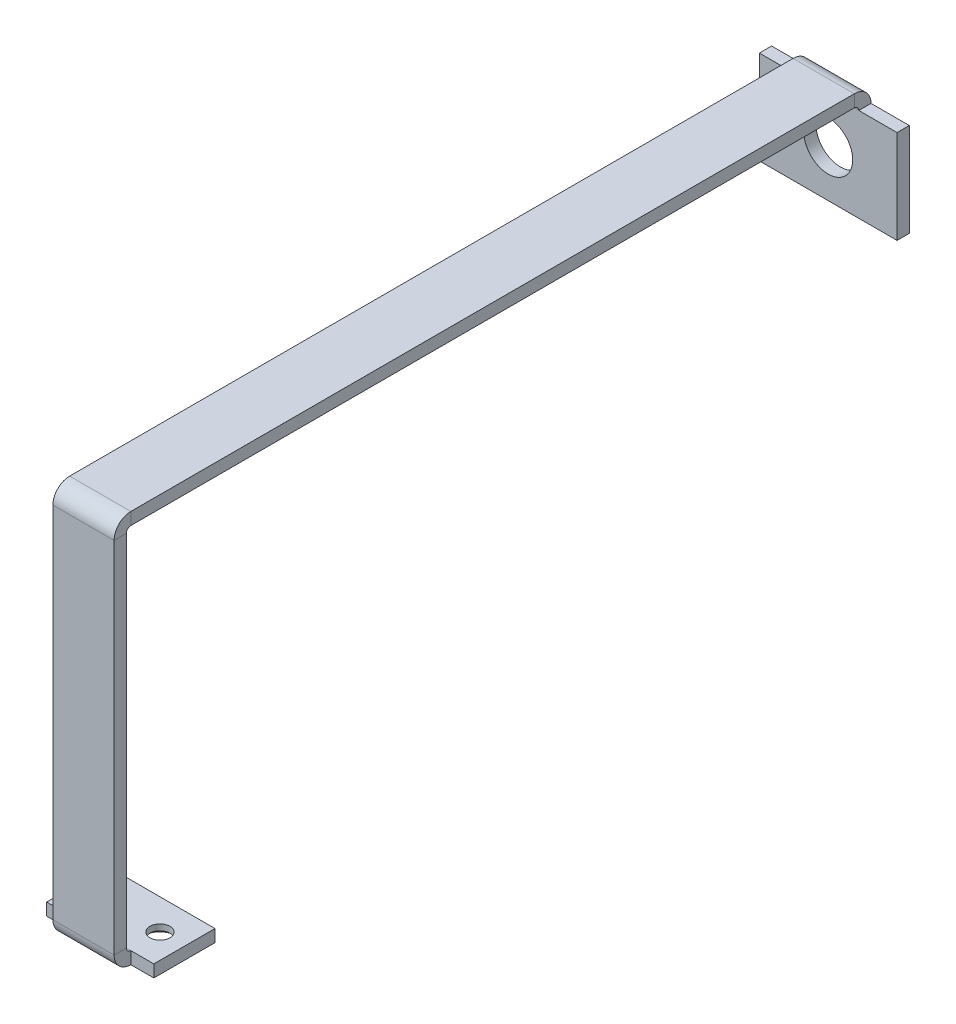
ISO-10303-21;
HEADER;
FILE_DESCRIPTION(('STEP AP214'),'2;1');
FILE_NAME('part.step','',(''),(''),'','','');
FILE_SCHEMA(('AUTOMOTIVE_DESIGN { 1 0 10303 214 1 1 1 1 }'));
ENDSEC;
DATA;
#1=APPLICATION_CONTEXT('core data for automotive mechanical design processes');
#2=APPLICATION_PROTOCOL_DEFINITION('international standard','automotive_design',2000,#1);
#3=PRODUCT_CONTEXT('',#1,'mechanical');
#4=PRODUCT('Part','Part','',(#3));
#5=PRODUCT_RELATED_PRODUCT_CATEGORY('part','',(#4));
#6=PRODUCT_DEFINITION_FORMATION('','',#4);
#7=PRODUCT_DEFINITION_CONTEXT('part definition',#1,'design');
#8=PRODUCT_DEFINITION('design','',#6,#7);
#9=PRODUCT_DEFINITION_SHAPE('','',#8);
#10=(LENGTH_UNIT() NAMED_UNIT(*) SI_UNIT(.MILLI.,.METRE.));
#11=(NAMED_UNIT(*) PLANE_ANGLE_UNIT() SI_UNIT($,.RADIAN.));
#12=(NAMED_UNIT(*) SI_UNIT($,.STERADIAN.) SOLID_ANGLE_UNIT());
#13=UNCERTAINTY_MEASURE_WITH_UNIT(LENGTH_MEASURE(1.E-05),#10,'distance_accuracy_value','');
#14=(GEOMETRIC_REPRESENTATION_CONTEXT(3) GLOBAL_UNCERTAINTY_ASSIGNED_CONTEXT((#13)) GLOBAL_UNIT_ASSIGNED_CONTEXT((#10,
#11,#12)) REPRESENTATION_CONTEXT('',''));
#15=CARTESIAN_POINT('',(0.,0.,0.));
#16=DIRECTION('',(0.,0.,1.));
#17=DIRECTION('',(1.,0.,0.));
#18=AXIS2_PLACEMENT_3D('',#15,#16,#17);
#19=CARTESIAN_POINT('',(0.,2.,0.));
#20=DIRECTION('',(0.,1.,0.));
#21=DIRECTION('',(0.,0.,1.));
#22=AXIS2_PLACEMENT_3D('',#19,#20,#21);
#23=PLANE('',#22);
#24=CARTESIAN_POINT('',(-4.75,2.,0.));
#25=DIRECTION('',(0.,1.,0.));
#26=DIRECTION('',(0.,0.,1.));
#27=AXIS2_PLACEMENT_3D('',#24,#25,#26);
#28=CIRCLE('',#27,1.63194999999999);
#29=CARTESIAN_POINT('',(-4.75,2.,1.63194999999999));
#30=VERTEX_POINT('',#29);
#31=EDGE_CURVE('E551',#30,#30,#28,.F.);
#32=ORIENTED_EDGE('',*,*,#31,.T.);
#33=EDGE_LOOP('',(#32));
#34=FACE_BOUND('',#33,.T.);
#35=DIRECTION('',(0.,0.,-1.));
#36=VECTOR('',#35,1.);
#37=CARTESIAN_POINT('',(8.75,2.,-5.));
#38=LINE('',#37,#36);
#39=CARTESIAN_POINT('',(8.75,2.,5.));
#40=VERTEX_POINT('',#39);
#41=CARTESIAN_POINT('',(8.75,2.,-5.));
#42=VERTEX_POINT('',#41);
#43=EDGE_CURVE('E454',#40,#42,#38,.T.);
#44=ORIENTED_EDGE('',*,*,#43,.T.);
#45=DIRECTION('',(-1.,0.,0.));
#46=VECTOR('',#45,1.);
#47=CARTESIAN_POINT('',(-8.75,2.,-5.));
#48=LINE('',#47,#46);
#49=CARTESIAN_POINT('',(-8.75,2.,-5.));
#50=VERTEX_POINT('',#49);
#51=EDGE_CURVE('E458',#42,#50,#48,.T.);
#52=ORIENTED_EDGE('',*,*,#51,.T.);
#53=DIRECTION('',(0.,0.,1.));
#54=VECTOR('',#53,1.);
#55=CARTESIAN_POINT('',(-8.75,2.,-5.));
#56=LINE('',#55,#54);
#57=CARTESIAN_POINT('',(-8.75,2.,5.));
#58=VERTEX_POINT('',#57);
#59=EDGE_CURVE('E462',#50,#58,#56,.T.);
#60=ORIENTED_EDGE('',*,*,#59,.T.);
#61=DIRECTION('',(1.,0.,0.));
#62=VECTOR('',#61,1.);
#63=CARTESIAN_POINT('',(-8.75,2.,5.));
#64=LINE('',#63,#62);
#65=CARTESIAN_POINT('',(-4.99999999999999,2.,5.));
#66=VERTEX_POINT('',#65);
#67=EDGE_CURVE('E466',#58,#66,#64,.T.);
#68=ORIENTED_EDGE('',*,*,#67,.T.);
#69=DIRECTION('',(1.,0.,0.));
#70=VECTOR('',#69,1.);
#71=CARTESIAN_POINT('',(4.99999999999999,2.,5.));
#72=LINE('',#71,#70);
#73=CARTESIAN_POINT('',(4.99999999999999,2.,5.));
#74=VERTEX_POINT('',#73);
#75=EDGE_CURVE('E441',#74,#66,#72,.F.);
#76=ORIENTED_EDGE('',*,*,#75,.F.);
#77=EDGE_CURVE('E465',#74,#40,#64,.T.);
#78=ORIENTED_EDGE('',*,*,#77,.T.);
#79=EDGE_LOOP('',(#44,#52,#60,#68,#76,#78));
#80=FACE_BOUND('',#79,.T.);
#81=CARTESIAN_POINT('',(4.75,2.,0.));
#82=DIRECTION('',(0.,1.,0.));
#83=DIRECTION('',(0.,0.,1.));
#84=AXIS2_PLACEMENT_3D('',#81,#82,#83);
#85=CIRCLE('',#84,1.63194999999999);
#86=CARTESIAN_POINT('',(4.75,2.,1.63194999999999));
#87=VERTEX_POINT('',#86);
#88=EDGE_CURVE('E539',#87,#87,#85,.F.);
#89=ORIENTED_EDGE('',*,*,#88,.T.);
#90=EDGE_LOOP('',(#89));
#91=FACE_BOUND('',#90,.T.);
#92=ADVANCED_FACE('F107',(#34,#80,#91),#23,.T.);
#93=CARTESIAN_POINT('',(4.99999999999998,64.1500000000004,-115.9484));
#94=DIRECTION('',(-1.,0.,0.));
#95=DIRECTION('',(0.,0.,1.));
#96=AXIS2_PLACEMENT_3D('',#93,#94,#95);
#97=PLANE('',#96);
#98=DIRECTION('',(0.,1.,0.));
#99=VECTOR('',#98,1.);
#100=CARTESIAN_POINT('',(4.99999999999998,62.1500000000004,-113.2118));
#101=LINE('',#100,#99);
#102=CARTESIAN_POINT('',(4.99999999999998,62.1500000000004,-113.2118));
#103=VERTEX_POINT('',#102);
#104=CARTESIAN_POINT('',(4.99999999999998,64.1500000000004,-113.2118));
#105=VERTEX_POINT('',#104);
#106=EDGE_CURVE('E307',#103,#105,#101,.T.);
#107=ORIENTED_EDGE('',*,*,#106,.T.);
#108=DIRECTION('',(0.,0.,-1.));
#109=VECTOR('',#108,1.);
#110=CARTESIAN_POINT('',(4.99999999999998,64.15,2.3363962117504E-13));
#111=LINE('',#110,#109);
#112=CARTESIAN_POINT('',(4.99999999999998,64.15,5.));
#113=VERTEX_POINT('',#112);
#114=EDGE_CURVE('E346',#113,#105,#111,.T.);
#115=ORIENTED_EDGE('',*,*,#114,.F.);
#116=DIRECTION('',(0.,-1.,0.));
#117=VECTOR('',#116,1.);
#118=CARTESIAN_POINT('',(4.99999999999998,62.15,4.99999999999999));
#119=LINE('',#118,#117);
#120=CARTESIAN_POINT('',(4.99999999999998,62.15,4.99999999999999));
#121=VERTEX_POINT('',#120);
#122=EDGE_CURVE('E359',#121,#113,#119,.F.);
#123=ORIENTED_EDGE('',*,*,#122,.F.);
#124=DIRECTION('',(0.,0.,1.));
#125=VECTOR('',#124,1.);
#126=CARTESIAN_POINT('',(4.99999999999998,62.1500000000004,-115.9484));
#127=LINE('',#126,#125);
#128=EDGE_CURVE('E352',#121,#103,#127,.F.);
#129=ORIENTED_EDGE('',*,*,#128,.T.);
#130=EDGE_LOOP('',(#107,#115,#123,#129));
#131=FACE_BOUND('',#130,.T.);
#132=ADVANCED_FACE('F595',(#131),#97,.F.);
#133=CARTESIAN_POINT('',(-5.00000000000002,64.15,5.7366));
#134=DIRECTION('',(1.,0.,0.));
#135=DIRECTION('',(0.,0.,-1.));
#136=AXIS2_PLACEMENT_3D('',#133,#134,#135);
#137=PLANE('',#136);
#138=DIRECTION('',(0.,1.,0.));
#139=VECTOR('',#138,1.);
#140=CARTESIAN_POINT('',(-5.00000000000002,62.1500000000004,-113.2118));
#141=LINE('',#140,#139);
#142=CARTESIAN_POINT('',(-5.00000000000002,62.1500000000004,-113.2118));
#143=VERTEX_POINT('',#142);
#144=CARTESIAN_POINT('',(-5.00000000000002,64.1500000000004,-113.2118));
#145=VERTEX_POINT('',#144);
#146=EDGE_CURVE('E328',#143,#145,#141,.T.);
#147=ORIENTED_EDGE('',*,*,#146,.F.);
#148=DIRECTION('',(0.,0.,-1.));
#149=VECTOR('',#148,1.);
#150=CARTESIAN_POINT('',(-5.00000000000002,62.15,5.7366));
#151=LINE('',#150,#149);
#152=CARTESIAN_POINT('',(-5.00000000000001,62.15,4.99999999999999));
#153=VERTEX_POINT('',#152);
#154=EDGE_CURVE('E349',#143,#153,#151,.F.);
#155=ORIENTED_EDGE('',*,*,#154,.T.);
#156=DIRECTION('',(0.,-1.,0.));
#157=VECTOR('',#156,1.);
#158=CARTESIAN_POINT('',(-5.00000000000002,64.15,5.));
#159=LINE('',#158,#157);
#160=CARTESIAN_POINT('',(-5.00000000000001,64.15,5.));
#161=VERTEX_POINT('',#160);
#162=EDGE_CURVE('E338',#153,#161,#159,.F.);
#163=ORIENTED_EDGE('',*,*,#162,.T.);
#164=DIRECTION('',(0.,0.,1.));
#165=VECTOR('',#164,1.);
#166=CARTESIAN_POINT('',(-5.00000000000002,64.15,2.33924738235643E-13));
#167=LINE('',#166,#165);
#168=EDGE_CURVE('E342',#145,#161,#167,.T.);
#169=ORIENTED_EDGE('',*,*,#168,.F.);
#170=EDGE_LOOP('',(#147,#155,#163,#169));
#171=FACE_BOUND('',#170,.T.);
#172=ADVANCED_FACE('F602',(#171),#137,.F.);
#173=CARTESIAN_POINT('',(0.,64.15,2.33782179705342E-13));
#174=DIRECTION('',(0.,-1.,0.));
#175=DIRECTION('',(0.,0.,-1.));
#176=AXIS2_PLACEMENT_3D('',#173,#174,#175);
#177=PLANE('',#176);
#178=DIRECTION('',(1.,0.,0.));
#179=VECTOR('',#178,1.);
#180=CARTESIAN_POINT('',(4.99999999999998,64.1500000000004,-113.2118));
#181=LINE('',#180,#179);
#182=EDGE_CURVE('E300',#105,#145,#181,.F.);
#183=ORIENTED_EDGE('',*,*,#182,.T.);
#184=ORIENTED_EDGE('',*,*,#168,.T.);
#185=DIRECTION('',(1.,0.,0.));
#186=VECTOR('',#185,1.);
#187=CARTESIAN_POINT('',(-5.00000000000002,64.15,5.));
#188=LINE('',#187,#186);
#189=EDGE_CURVE('E355',#113,#161,#188,.F.);
#190=ORIENTED_EDGE('',*,*,#189,.F.);
#191=ORIENTED_EDGE('',*,*,#114,.T.);
#192=EDGE_LOOP('',(#183,#184,#190,#191));
#193=FACE_BOUND('',#192,.T.);
#194=ADVANCED_FACE('F726',(#193),#177,.F.);
#195=CARTESIAN_POINT('',(0.,62.15,2.26799217027655E-13));
#196=DIRECTION('',(0.,-1.,0.));
#197=DIRECTION('',(0.,0.,-1.));
#198=AXIS2_PLACEMENT_3D('',#195,#196,#197);
#199=PLANE('',#198);
#200=ORIENTED_EDGE('',*,*,#154,.F.);
#201=DIRECTION('',(1.,0.,0.));
#202=VECTOR('',#201,1.);
#203=CARTESIAN_POINT('',(4.99999999999998,62.1500000000004,-113.2118));
#204=LINE('',#203,#202);
#205=EDGE_CURVE('E123',#103,#143,#204,.F.);
#206=ORIENTED_EDGE('',*,*,#205,.F.);
#207=ORIENTED_EDGE('',*,*,#128,.F.);
#208=DIRECTION('',(1.,0.,0.));
#209=VECTOR('',#208,1.);
#210=CARTESIAN_POINT('',(-5.00000000000002,62.15,4.99999999999999));
#211=LINE('',#210,#209);
#212=EDGE_CURVE('E363',#153,#121,#211,.T.);
#213=ORIENTED_EDGE('',*,*,#212,.F.);
#214=EDGE_LOOP('',(#200,#206,#207,#213));
#215=FACE_BOUND('',#214,.T.);
#216=ADVANCED_FACE('F640',(#215),#199,.T.);
#217=CARTESIAN_POINT('',(4.99999999999998,64.15,7.7366));
#218=DIRECTION('',(-1.,0.,0.));
#219=DIRECTION('',(0.,-1.,0.));
#220=AXIS2_PLACEMENT_3D('',#217,#218,#219);
#221=PLANE('',#220);
#222=DIRECTION('',(0.,0.,1.));
#223=VECTOR('',#222,1.);
#224=CARTESIAN_POINT('',(4.99999999999998,61.4134,5.73659999999999));
#225=LINE('',#224,#223);
#226=CARTESIAN_POINT('',(4.99999999999998,61.4134,5.7366));
#227=VERTEX_POINT('',#226);
#228=CARTESIAN_POINT('',(4.99999999999998,61.4134,7.73659999999998));
#229=VERTEX_POINT('',#228);
#230=EDGE_CURVE('E377',#227,#229,#225,.T.);
#231=ORIENTED_EDGE('',*,*,#230,.T.);
#232=DIRECTION('',(0.,1.,0.));
#233=VECTOR('',#232,1.);
#234=CARTESIAN_POINT('',(4.99999999999999,0.,7.7366));
#235=LINE('',#234,#233);
#236=CARTESIAN_POINT('',(4.99999999999999,2.7366,7.7366));
#237=VERTEX_POINT('',#236);
#238=EDGE_CURVE('E402',#237,#229,#235,.T.);
#239=ORIENTED_EDGE('',*,*,#238,.F.);
#240=DIRECTION('',(0.,0.,-1.));
#241=VECTOR('',#240,1.);
#242=CARTESIAN_POINT('',(4.99999999999999,2.7366,5.7366));
#243=LINE('',#242,#241);
#244=CARTESIAN_POINT('',(4.99999999999999,2.7366,5.7366));
#245=VERTEX_POINT('',#244);
#246=EDGE_CURVE('E415',#245,#237,#243,.F.);
#247=ORIENTED_EDGE('',*,*,#246,.F.);
#248=DIRECTION('',(0.,-1.,0.));
#249=VECTOR('',#248,1.);
#250=CARTESIAN_POINT('',(4.99999999999998,64.15,5.7366));
#251=LINE('',#250,#249);
#252=EDGE_CURVE('E408',#245,#227,#251,.F.);
#253=ORIENTED_EDGE('',*,*,#252,.T.);
#254=EDGE_LOOP('',(#231,#239,#247,#253));
#255=FACE_BOUND('',#254,.T.);
#256=ADVANCED_FACE('F636',(#255),#221,.F.);
#257=CARTESIAN_POINT('',(-4.99999999999999,2.,7.7366));
#258=DIRECTION('',(1.,0.,0.));
#259=DIRECTION('',(0.,1.,0.));
#260=AXIS2_PLACEMENT_3D('',#257,#258,#259);
#261=PLANE('',#260);
#262=DIRECTION('',(0.,0.,1.));
#263=VECTOR('',#262,1.);
#264=CARTESIAN_POINT('',(-5.00000000000001,61.4134,5.73659999999999));
#265=LINE('',#264,#263);
#266=CARTESIAN_POINT('',(-5.00000000000001,61.4134,5.73659999999999));
#267=VERTEX_POINT('',#266);
#268=CARTESIAN_POINT('',(-5.00000000000001,61.4134,7.7366));
#269=VERTEX_POINT('',#268);
#270=EDGE_CURVE('E390',#267,#269,#265,.T.);
#271=ORIENTED_EDGE('',*,*,#270,.F.);
#272=DIRECTION('',(0.,1.,0.));
#273=VECTOR('',#272,1.);
#274=CARTESIAN_POINT('',(-4.99999999999999,2.,5.7366));
#275=LINE('',#274,#273);
#276=CARTESIAN_POINT('',(-4.99999999999999,2.7366,5.7366));
#277=VERTEX_POINT('',#276);
#278=EDGE_CURVE('E405',#267,#277,#275,.F.);
#279=ORIENTED_EDGE('',*,*,#278,.T.);
#280=DIRECTION('',(0.,0.,-1.));
#281=VECTOR('',#280,1.);
#282=CARTESIAN_POINT('',(-4.99999999999999,2.7366,7.7366));
#283=LINE('',#282,#281);
#284=CARTESIAN_POINT('',(-4.99999999999998,2.7366,7.7366));
#285=VERTEX_POINT('',#284);
#286=EDGE_CURVE('E394',#277,#285,#283,.F.);
#287=ORIENTED_EDGE('',*,*,#286,.T.);
#288=DIRECTION('',(0.,-1.,0.));
#289=VECTOR('',#288,1.);
#290=CARTESIAN_POINT('',(-4.99999999999999,0.,7.7366));
#291=LINE('',#290,#289);
#292=EDGE_CURVE('E398',#269,#285,#291,.T.);
#293=ORIENTED_EDGE('',*,*,#292,.F.);
#294=EDGE_LOOP('',(#271,#279,#287,#293));
#295=FACE_BOUND('',#294,.T.);
#296=ADVANCED_FACE('F629',(#295),#261,.F.);
#297=CARTESIAN_POINT('',(0.,0.,7.7366));
#298=DIRECTION('',(0.,0.,-1.));
#299=DIRECTION('',(-1.,0.,0.));
#300=AXIS2_PLACEMENT_3D('',#297,#298,#299);
#301=PLANE('',#300);
#302=DIRECTION('',(1.,0.,0.));
#303=VECTOR('',#302,1.);
#304=CARTESIAN_POINT('',(4.99999999999998,61.4134,7.73659999999998));
#305=LINE('',#304,#303);
#306=EDGE_CURVE('E369',#229,#269,#305,.F.);
#307=ORIENTED_EDGE('',*,*,#306,.T.);
#308=ORIENTED_EDGE('',*,*,#292,.T.);
#309=DIRECTION('',(1.,0.,0.));
#310=VECTOR('',#309,1.);
#311=CARTESIAN_POINT('',(-5.00000000000001,2.7366,7.7366));
#312=LINE('',#311,#310);
#313=EDGE_CURVE('E411',#237,#285,#312,.F.);
#314=ORIENTED_EDGE('',*,*,#313,.F.);
#315=ORIENTED_EDGE('',*,*,#238,.T.);
#316=EDGE_LOOP('',(#307,#308,#314,#315));
#317=FACE_BOUND('',#316,.T.);
#318=ADVANCED_FACE('F623',(#317),#301,.F.);
#319=CARTESIAN_POINT('',(0.,0.,5.7366));
#320=DIRECTION('',(0.,0.,-1.));
#321=DIRECTION('',(-1.,0.,0.));
#322=AXIS2_PLACEMENT_3D('',#319,#320,#321);
#323=PLANE('',#322);
#324=ORIENTED_EDGE('',*,*,#278,.F.);
#325=DIRECTION('',(1.,0.,0.));
#326=VECTOR('',#325,1.);
#327=CARTESIAN_POINT('',(4.99999999999998,61.4134,5.73659999999999));
#328=LINE('',#327,#326);
#329=EDGE_CURVE('E131',#227,#267,#328,.F.);
#330=ORIENTED_EDGE('',*,*,#329,.F.);
#331=ORIENTED_EDGE('',*,*,#252,.F.);
#332=DIRECTION('',(1.,0.,0.));
#333=VECTOR('',#332,1.);
#334=CARTESIAN_POINT('',(-5.00000000000001,2.7366,5.7366));
#335=LINE('',#334,#333);
#336=EDGE_CURVE('E419',#277,#245,#335,.T.);
#337=ORIENTED_EDGE('',*,*,#336,.F.);
#338=EDGE_LOOP('',(#324,#330,#331,#337));
#339=FACE_BOUND('',#338,.T.);
#340=ADVANCED_FACE('F619',(#339),#323,.T.);
#341=CARTESIAN_POINT('',(-8.75,2.,5.));
#342=DIRECTION('',(0.,0.,-1.));
#343=DIRECTION('',(-1.,0.,0.));
#344=AXIS2_PLACEMENT_3D('',#341,#342,#343);
#345=PLANE('',#344);
#346=DIRECTION('',(0.,-1.,0.));
#347=VECTOR('',#346,1.);
#348=CARTESIAN_POINT('',(-4.99999999999999,2.,5.));
#349=LINE('',#348,#347);
#350=CARTESIAN_POINT('',(-4.99999999999998,0.,5.));
#351=VERTEX_POINT('',#350);
#352=EDGE_CURVE('E447',#66,#351,#349,.T.);
#353=ORIENTED_EDGE('',*,*,#352,.F.);
#354=ORIENTED_EDGE('',*,*,#67,.F.);
#355=DIRECTION('',(0.,-1.,0.));
#356=VECTOR('',#355,1.);
#357=CARTESIAN_POINT('',(-8.75,2.,5.));
#358=LINE('',#357,#356);
#359=CARTESIAN_POINT('',(-8.75,0.,5.));
#360=VERTEX_POINT('',#359);
#361=EDGE_CURVE('E487',#58,#360,#358,.T.);
#362=ORIENTED_EDGE('',*,*,#361,.T.);
#363=DIRECTION('',(1.,0.,0.));
#364=VECTOR('',#363,1.);
#365=CARTESIAN_POINT('',(-8.75,0.,5.));
#366=LINE('',#365,#364);
#367=EDGE_CURVE('E459',#360,#351,#366,.T.);
#368=ORIENTED_EDGE('',*,*,#367,.T.);
#369=EDGE_LOOP('',(#353,#354,#362,#368));
#370=FACE_BOUND('',#369,.T.);
#371=ADVANCED_FACE('F507',(#370),#345,.F.);
#372=CARTESIAN_POINT('',(8.75,2.,-5.));
#373=DIRECTION('',(-1.,0.,0.));
#374=DIRECTION('',(0.,0.,1.));
#375=AXIS2_PLACEMENT_3D('',#372,#373,#374);
#376=PLANE('',#375);
#377=DIRECTION('',(0.,0.,-1.));
#378=VECTOR('',#377,1.);
#379=CARTESIAN_POINT('',(8.75,0.,-5.));
#380=LINE('',#379,#378);
#381=CARTESIAN_POINT('',(8.75,0.,5.));
#382=VERTEX_POINT('',#381);
#383=CARTESIAN_POINT('',(8.75,0.,-5.));
#384=VERTEX_POINT('',#383);
#385=EDGE_CURVE('E450',#382,#384,#380,.T.);
#386=ORIENTED_EDGE('',*,*,#385,.T.);
#387=DIRECTION('',(0.,-1.,0.));
#388=VECTOR('',#387,1.);
#389=CARTESIAN_POINT('',(8.75,2.,-5.));
#390=LINE('',#389,#388);
#391=EDGE_CURVE('E13',#42,#384,#390,.T.);
#392=ORIENTED_EDGE('',*,*,#391,.F.);
#393=ORIENTED_EDGE('',*,*,#43,.F.);
#394=DIRECTION('',(0.,-1.,0.));
#395=VECTOR('',#394,1.);
#396=CARTESIAN_POINT('',(8.75,2.,5.));
#397=LINE('',#396,#395);
#398=EDGE_CURVE('E470',#40,#382,#397,.T.);
#399=ORIENTED_EDGE('',*,*,#398,.T.);
#400=EDGE_LOOP('',(#386,#392,#393,#399));
#401=FACE_BOUND('',#400,.T.);
#402=ADVANCED_FACE('F109',(#401),#376,.F.);
#403=CARTESIAN_POINT('',(-8.75,2.,-5.));
#404=DIRECTION('',(0.,0.,1.));
#405=DIRECTION('',(1.,0.,0.));
#406=AXIS2_PLACEMENT_3D('',#403,#404,#405);
#407=PLANE('',#406);
#408=DIRECTION('',(-1.,0.,0.));
#409=VECTOR('',#408,1.);
#410=CARTESIAN_POINT('',(-8.75,0.,-5.));
#411=LINE('',#410,#409);
#412=CARTESIAN_POINT('',(-8.75,0.,-5.));
#413=VERTEX_POINT('',#412);
#414=EDGE_CURVE('E474',#384,#413,#411,.T.);
#415=ORIENTED_EDGE('',*,*,#414,.T.);
#416=DIRECTION('',(0.,-1.,0.));
#417=VECTOR('',#416,1.);
#418=CARTESIAN_POINT('',(-8.75,2.,-5.));
#419=LINE('',#418,#417);
#420=EDGE_CURVE('E116',#50,#413,#419,.T.);
#421=ORIENTED_EDGE('',*,*,#420,.F.);
#422=ORIENTED_EDGE('',*,*,#51,.F.);
#423=ORIENTED_EDGE('',*,*,#391,.T.);
#424=EDGE_LOOP('',(#415,#421,#422,#423));
#425=FACE_BOUND('',#424,.T.);
#426=ADVANCED_FACE('F514',(#425),#407,.F.);
#427=CARTESIAN_POINT('',(-8.75,2.,-5.));
#428=DIRECTION('',(1.,0.,0.));
#429=DIRECTION('',(0.,0.,-1.));
#430=AXIS2_PLACEMENT_3D('',#427,#428,#429);
#431=PLANE('',#430);
#432=DIRECTION('',(0.,0.,1.));
#433=VECTOR('',#432,1.);
#434=CARTESIAN_POINT('',(-8.75,0.,-5.));
#435=LINE('',#434,#433);
#436=EDGE_CURVE('E477',#413,#360,#435,.T.);
#437=ORIENTED_EDGE('',*,*,#436,.T.);
#438=ORIENTED_EDGE('',*,*,#361,.F.);
#439=ORIENTED_EDGE('',*,*,#59,.F.);
#440=ORIENTED_EDGE('',*,*,#420,.T.);
#441=EDGE_LOOP('',(#437,#438,#439,#440));
#442=FACE_BOUND('',#441,.T.);
#443=ADVANCED_FACE('F496',(#442),#431,.F.);
#444=ORIENTED_EDGE('',*,*,#77,.F.);
#445=DIRECTION('',(0.,-1.,0.));
#446=VECTOR('',#445,1.);
#447=CARTESIAN_POINT('',(4.99999999999999,2.,5.));
#448=LINE('',#447,#446);
#449=CARTESIAN_POINT('',(4.99999999999999,0.,5.));
#450=VERTEX_POINT('',#449);
#451=EDGE_CURVE('E434',#74,#450,#448,.T.);
#452=ORIENTED_EDGE('',*,*,#451,.T.);
#453=EDGE_CURVE('E480',#450,#382,#366,.T.);
#454=ORIENTED_EDGE('',*,*,#453,.T.);
#455=ORIENTED_EDGE('',*,*,#398,.F.);
#456=EDGE_LOOP('',(#444,#452,#454,#455));
#457=FACE_BOUND('',#456,.T.);
#458=ADVANCED_FACE('F574',(#457),#345,.F.);
#459=CARTESIAN_POINT('',(0.,0.,0.));
#460=DIRECTION('',(0.,1.,0.));
#461=DIRECTION('',(0.,0.,1.));
#462=AXIS2_PLACEMENT_3D('',#459,#460,#461);
#463=PLANE('',#462);
#464=CARTESIAN_POINT('',(-4.75,0.,0.));
#465=DIRECTION('',(0.,-1.,0.));
#466=DIRECTION('',(0.,0.,-1.));
#467=AXIS2_PLACEMENT_3D('',#464,#465,#466);
#468=CIRCLE('',#467,2.8575);
#469=CARTESIAN_POINT('',(-4.75,0.,-2.8575));
#470=VERTEX_POINT('',#469);
#471=EDGE_CURVE('E555',#470,#470,#468,.T.);
#472=ORIENTED_EDGE('',*,*,#471,.F.);
#473=EDGE_LOOP('',(#472));
#474=FACE_BOUND('',#473,.T.);
#475=CARTESIAN_POINT('',(4.75,0.,0.));
#476=DIRECTION('',(0.,-1.,0.));
#477=DIRECTION('',(0.,0.,-1.));
#478=AXIS2_PLACEMENT_3D('',#475,#476,#477);
#479=CIRCLE('',#478,2.8575);
#480=CARTESIAN_POINT('',(4.75,0.,-2.8575));
#481=VERTEX_POINT('',#480);
#482=EDGE_CURVE('E543',#481,#481,#479,.T.);
#483=ORIENTED_EDGE('',*,*,#482,.F.);
#484=EDGE_LOOP('',(#483));
#485=FACE_BOUND('',#484,.T.);
#486=ORIENTED_EDGE('',*,*,#385,.F.);
#487=ORIENTED_EDGE('',*,*,#453,.F.);
#488=DIRECTION('',(1.,0.,0.));
#489=VECTOR('',#488,1.);
#490=CARTESIAN_POINT('',(4.99999999999999,0.,5.));
#491=LINE('',#490,#489);
#492=EDGE_CURVE('E425',#450,#351,#491,.F.);
#493=ORIENTED_EDGE('',*,*,#492,.T.);
#494=ORIENTED_EDGE('',*,*,#367,.F.);
#495=ORIENTED_EDGE('',*,*,#436,.F.);
#496=ORIENTED_EDGE('',*,*,#414,.F.);
#497=EDGE_LOOP('',(#486,#487,#493,#494,#495,#496));
#498=FACE_BOUND('',#497,.T.);
#499=ADVANCED_FACE('F502',(#474,#485,#498),#463,.F.);
#500=CARTESIAN_POINT('',(-4.99999999999999,2.7366,5.));
#501=DIRECTION('',(-1.,0.,0.));
#502=DIRECTION('',(0.,0.,1.));
#503=AXIS2_PLACEMENT_3D('',#500,#501,#502);
#504=PLANE('',#503);
#505=ORIENTED_EDGE('',*,*,#286,.F.);
#506=CARTESIAN_POINT('',(-4.99999999999999,2.7366,5.));
#507=DIRECTION('',(1.,0.,0.));
#508=DIRECTION('',(0.,0.,-1.));
#509=AXIS2_PLACEMENT_3D('',#506,#507,#508);
#510=CIRCLE('',#509,0.736599999999998);
#511=EDGE_CURVE('E437',#66,#277,#510,.F.);
#512=ORIENTED_EDGE('',*,*,#511,.F.);
#513=ORIENTED_EDGE('',*,*,#352,.T.);
#514=CARTESIAN_POINT('',(-4.99999999999998,2.7366,5.));
#515=DIRECTION('',(1.,0.,0.));
#516=DIRECTION('',(0.,0.,-1.));
#517=AXIS2_PLACEMENT_3D('',#514,#515,#516);
#518=CIRCLE('',#517,2.7366);
#519=EDGE_CURVE('E429',#351,#285,#518,.F.);
#520=ORIENTED_EDGE('',*,*,#519,.T.);
#521=EDGE_LOOP('',(#505,#512,#513,#520));
#522=FACE_BOUND('',#521,.T.);
#523=ADVANCED_FACE('F573',(#522),#504,.T.);
#524=CARTESIAN_POINT('',(4.99999999999999,2.7366,5.));
#525=DIRECTION('',(-1.,0.,0.));
#526=DIRECTION('',(0.,0.,1.));
#527=AXIS2_PLACEMENT_3D('',#524,#525,#526);
#528=PLANE('',#527);
#529=CARTESIAN_POINT('',(4.99999999999999,2.7366,5.));
#530=DIRECTION('',(1.,0.,0.));
#531=DIRECTION('',(0.,0.,-1.));
#532=AXIS2_PLACEMENT_3D('',#529,#530,#531);
#533=CIRCLE('',#532,0.736599999999998);
#534=EDGE_CURVE('E401',#245,#74,#533,.T.);
#535=ORIENTED_EDGE('',*,*,#534,.F.);
#536=ORIENTED_EDGE('',*,*,#246,.T.);
#537=CARTESIAN_POINT('',(4.99999999999999,2.7366,5.));
#538=DIRECTION('',(1.,0.,0.));
#539=DIRECTION('',(0.,0.,-1.));
#540=AXIS2_PLACEMENT_3D('',#537,#538,#539);
#541=CIRCLE('',#540,2.7366);
#542=EDGE_CURVE('E430',#237,#450,#541,.T.);
#543=ORIENTED_EDGE('',*,*,#542,.T.);
#544=ORIENTED_EDGE('',*,*,#451,.F.);
#545=EDGE_LOOP('',(#535,#536,#543,#544));
#546=FACE_BOUND('',#545,.T.);
#547=ADVANCED_FACE('F606',(#546),#528,.F.);
#548=CARTESIAN_POINT('',(4.99999999999999,2.7366,5.));
#549=DIRECTION('',(1.,0.,0.));
#550=DIRECTION('',(0.,0.,1.));
#551=AXIS2_PLACEMENT_3D('',#548,#549,#550);
#552=CYLINDRICAL_SURFACE('',#551,2.7366);
#553=ORIENTED_EDGE('',*,*,#492,.F.);
#554=ORIENTED_EDGE('',*,*,#542,.F.);
#555=ORIENTED_EDGE('',*,*,#313,.T.);
#556=ORIENTED_EDGE('',*,*,#519,.F.);
#557=EDGE_LOOP('',(#553,#554,#555,#556));
#558=FACE_BOUND('',#557,.T.);
#559=ADVANCED_FACE('F642',(#558),#552,.T.);
#560=CARTESIAN_POINT('',(4.99999999999999,2.7366,5.));
#561=DIRECTION('',(1.,0.,0.));
#562=DIRECTION('',(0.,0.,1.));
#563=AXIS2_PLACEMENT_3D('',#560,#561,#562);
#564=CYLINDRICAL_SURFACE('',#563,0.736599999999998);
#565=ORIENTED_EDGE('',*,*,#75,.T.);
#566=ORIENTED_EDGE('',*,*,#511,.T.);
#567=ORIENTED_EDGE('',*,*,#336,.T.);
#568=ORIENTED_EDGE('',*,*,#534,.T.);
#569=EDGE_LOOP('',(#565,#566,#567,#568));
#570=FACE_BOUND('',#569,.T.);
#571=ADVANCED_FACE('F645',(#570),#564,.F.);
#572=CARTESIAN_POINT('',(-5.00000000000001,61.4134,4.99999999999999));
#573=DIRECTION('',(-1.,0.,0.));
#574=DIRECTION('',(0.,0.,1.));
#575=AXIS2_PLACEMENT_3D('',#572,#573,#574);
#576=PLANE('',#575);
#577=ORIENTED_EDGE('',*,*,#162,.F.);
#578=CARTESIAN_POINT('',(-5.00000000000001,61.4134,4.99999999999999));
#579=DIRECTION('',(1.,0.,0.));
#580=DIRECTION('',(0.,0.,-1.));
#581=AXIS2_PLACEMENT_3D('',#578,#579,#580);
#582=CIRCLE('',#581,0.736599999999997);
#583=EDGE_CURVE('E381',#267,#153,#582,.F.);
#584=ORIENTED_EDGE('',*,*,#583,.F.);
#585=ORIENTED_EDGE('',*,*,#270,.T.);
#586=CARTESIAN_POINT('',(-5.00000000000001,61.4134,4.99999999999999));
#587=DIRECTION('',(1.,0.,0.));
#588=DIRECTION('',(0.,0.,-1.));
#589=AXIS2_PLACEMENT_3D('',#586,#587,#588);
#590=CIRCLE('',#589,2.7366);
#591=EDGE_CURVE('E372',#269,#161,#590,.F.);
#592=ORIENTED_EDGE('',*,*,#591,.T.);
#593=EDGE_LOOP('',(#577,#584,#585,#592));
#594=FACE_BOUND('',#593,.T.);
#595=ADVANCED_FACE('F648',(#594),#576,.T.);
#596=CARTESIAN_POINT('',(4.99999999999998,61.4134,4.99999999999999));
#597=DIRECTION('',(-1.,0.,0.));
#598=DIRECTION('',(0.,0.,1.));
#599=AXIS2_PLACEMENT_3D('',#596,#597,#598);
#600=PLANE('',#599);
#601=CARTESIAN_POINT('',(4.99999999999998,61.4134,4.99999999999999));
#602=DIRECTION('',(1.,0.,0.));
#603=DIRECTION('',(0.,0.,-1.));
#604=AXIS2_PLACEMENT_3D('',#601,#602,#603);
#605=CIRCLE('',#604,0.736599999999997);
#606=EDGE_CURVE('E345',#121,#227,#605,.T.);
#607=ORIENTED_EDGE('',*,*,#606,.F.);
#608=ORIENTED_EDGE('',*,*,#122,.T.);
#609=CARTESIAN_POINT('',(4.99999999999998,61.4134,4.99999999999999));
#610=DIRECTION('',(1.,0.,0.));
#611=DIRECTION('',(0.,0.,-1.));
#612=AXIS2_PLACEMENT_3D('',#609,#610,#611);
#613=CIRCLE('',#612,2.7366);
#614=EDGE_CURVE('E373',#113,#229,#613,.T.);
#615=ORIENTED_EDGE('',*,*,#614,.T.);
#616=ORIENTED_EDGE('',*,*,#230,.F.);
#617=EDGE_LOOP('',(#607,#608,#615,#616));
#618=FACE_BOUND('',#617,.T.);
#619=ADVANCED_FACE('F668',(#618),#600,.F.);
#620=CARTESIAN_POINT('',(4.99999999999998,61.4134,4.99999999999999));
#621=DIRECTION('',(1.,0.,0.));
#622=DIRECTION('',(0.,1.,0.));
#623=AXIS2_PLACEMENT_3D('',#620,#621,#622);
#624=CYLINDRICAL_SURFACE('',#623,2.7366);
#625=ORIENTED_EDGE('',*,*,#306,.F.);
#626=ORIENTED_EDGE('',*,*,#614,.F.);
#627=ORIENTED_EDGE('',*,*,#189,.T.);
#628=ORIENTED_EDGE('',*,*,#591,.F.);
#629=EDGE_LOOP('',(#625,#626,#627,#628));
#630=FACE_BOUND('',#629,.T.);
#631=ADVANCED_FACE('F735',(#630),#624,.T.);
#632=CARTESIAN_POINT('',(4.99999999999998,61.4134,4.99999999999999));
#633=DIRECTION('',(1.,0.,0.));
#634=DIRECTION('',(0.,1.,0.));
#635=AXIS2_PLACEMENT_3D('',#632,#633,#634);
#636=CYLINDRICAL_SURFACE('',#635,0.736599999999997);
#637=ORIENTED_EDGE('',*,*,#329,.T.);
#638=ORIENTED_EDGE('',*,*,#583,.T.);
#639=ORIENTED_EDGE('',*,*,#212,.T.);
#640=ORIENTED_EDGE('',*,*,#606,.T.);
#641=EDGE_LOOP('',(#637,#638,#639,#640));
#642=FACE_BOUND('',#641,.T.);
#643=ADVANCED_FACE('F671',(#642),#636,.F.);
#644=CARTESIAN_POINT('',(-5.00000000000002,61.4134000000004,-113.2118));
#645=DIRECTION('',(-1.,0.,0.));
#646=DIRECTION('',(0.,0.,1.));
#647=AXIS2_PLACEMENT_3D('',#644,#645,#646);
#648=PLANE('',#647);
#649=DIRECTION('',(0.,0.,-1.));
#650=VECTOR('',#649,1.);
#651=CARTESIAN_POINT('',(-5.00000000000002,61.4134000000004,-113.9484));
#652=LINE('',#651,#650);
#653=CARTESIAN_POINT('',(-5.00000000000002,61.4134000000004,-113.9484));
#654=VERTEX_POINT('',#653);
#655=CARTESIAN_POINT('',(-5.00000000000002,61.4134000000004,-115.9484));
#656=VERTEX_POINT('',#655);
#657=EDGE_CURVE('E332',#654,#656,#652,.T.);
#658=ORIENTED_EDGE('',*,*,#657,.F.);
#659=CARTESIAN_POINT('',(-5.00000000000002,61.4134000000004,-113.2118));
#660=DIRECTION('',(1.,0.,0.));
#661=DIRECTION('',(0.,0.,-1.));
#662=AXIS2_PLACEMENT_3D('',#659,#660,#661);
#663=CIRCLE('',#662,0.736600000000004);
#664=EDGE_CURVE('E312',#143,#654,#663,.F.);
#665=ORIENTED_EDGE('',*,*,#664,.F.);
#666=ORIENTED_EDGE('',*,*,#146,.T.);
#667=CARTESIAN_POINT('',(-5.00000000000002,61.4134000000004,-113.2118));
#668=DIRECTION('',(1.,0.,0.));
#669=DIRECTION('',(0.,0.,-1.));
#670=AXIS2_PLACEMENT_3D('',#667,#668,#669);
#671=CIRCLE('',#670,2.7366);
#672=EDGE_CURVE('E303',#145,#656,#671,.F.);
#673=ORIENTED_EDGE('',*,*,#672,.T.);
#674=EDGE_LOOP('',(#658,#665,#666,#673));
#675=FACE_BOUND('',#674,.T.);
#676=ADVANCED_FACE('F686',(#675),#648,.T.);
#677=CARTESIAN_POINT('',(4.99999999999998,61.4134000000004,-113.2118));
#678=DIRECTION('',(-1.,0.,0.));
#679=DIRECTION('',(0.,0.,1.));
#680=AXIS2_PLACEMENT_3D('',#677,#678,#679);
#681=PLANE('',#680);
#682=CARTESIAN_POINT('',(4.99999999999998,61.4134000000004,-113.2118));
#683=DIRECTION('',(1.,0.,0.));
#684=DIRECTION('',(0.,0.,-1.));
#685=AXIS2_PLACEMENT_3D('',#682,#683,#684);
#686=CIRCLE('',#685,0.736600000000004);
#687=CARTESIAN_POINT('',(4.99999999999998,61.4134000000004,-113.9484));
#688=VERTEX_POINT('',#687);
#689=EDGE_CURVE('E321',#688,#103,#686,.T.);
#690=ORIENTED_EDGE('',*,*,#689,.F.);
#691=DIRECTION('',(0.,0.,-1.));
#692=VECTOR('',#691,1.);
#693=CARTESIAN_POINT('',(4.99999999999998,61.4134000000004,-113.9484));
#694=LINE('',#693,#692);
#695=CARTESIAN_POINT('',(4.99999999999998,61.4134000000004,-115.9484));
#696=VERTEX_POINT('',#695);
#697=EDGE_CURVE('E335',#688,#696,#694,.T.);
#698=ORIENTED_EDGE('',*,*,#697,.T.);
#699=CARTESIAN_POINT('',(4.99999999999998,61.4134000000004,-113.2118));
#700=DIRECTION('',(1.,0.,0.));
#701=DIRECTION('',(0.,0.,-1.));
#702=AXIS2_PLACEMENT_3D('',#699,#700,#701);
#703=CIRCLE('',#702,2.7366);
#704=EDGE_CURVE('E304',#696,#105,#703,.T.);
#705=ORIENTED_EDGE('',*,*,#704,.T.);
#706=ORIENTED_EDGE('',*,*,#106,.F.);
#707=EDGE_LOOP('',(#690,#698,#705,#706));
#708=FACE_BOUND('',#707,.T.);
#709=ADVANCED_FACE('F679',(#708),#681,.F.);
#710=CARTESIAN_POINT('',(4.99999999999998,61.4134000000004,-113.2118));
#711=DIRECTION('',(1.,0.,0.));
#712=DIRECTION('',(0.,0.,-1.));
#713=AXIS2_PLACEMENT_3D('',#710,#711,#712);
#714=CYLINDRICAL_SURFACE('',#713,2.7366);
#715=ORIENTED_EDGE('',*,*,#182,.F.);
#716=ORIENTED_EDGE('',*,*,#704,.F.);
#717=DIRECTION('',(1.,0.,0.));
#718=VECTOR('',#717,1.);
#719=CARTESIAN_POINT('',(4.99999999999998,61.4134000000004,-115.9484));
#720=LINE('',#719,#718);
#721=EDGE_CURVE('E308',#656,#696,#720,.T.);
#722=ORIENTED_EDGE('',*,*,#721,.F.);
#723=ORIENTED_EDGE('',*,*,#672,.F.);
#724=EDGE_LOOP('',(#715,#716,#722,#723));
#725=FACE_BOUND('',#724,.T.);
#726=ADVANCED_FACE('F716',(#725),#714,.T.);
#727=CARTESIAN_POINT('',(4.99999999999998,61.4134000000004,-113.2118));
#728=DIRECTION('',(1.,0.,0.));
#729=DIRECTION('',(0.,0.,-1.));
#730=AXIS2_PLACEMENT_3D('',#727,#728,#729);
#731=CYLINDRICAL_SURFACE('',#730,0.736600000000004);
#732=ORIENTED_EDGE('',*,*,#205,.T.);
#733=ORIENTED_EDGE('',*,*,#664,.T.);
#734=DIRECTION('',(1.,0.,0.));
#735=VECTOR('',#734,1.);
#736=CARTESIAN_POINT('',(4.99999999999998,61.4134000000004,-113.9484));
#737=LINE('',#736,#735);
#738=EDGE_CURVE('E272',#654,#688,#737,.T.);
#739=ORIENTED_EDGE('',*,*,#738,.T.);
#740=ORIENTED_EDGE('',*,*,#689,.T.);
#741=EDGE_LOOP('',(#732,#733,#739,#740));
#742=FACE_BOUND('',#741,.T.);
#743=ADVANCED_FACE('F683',(#742),#731,.F.);
#744=CARTESIAN_POINT('',(-11.25,61.4134000000004,-113.9484));
#745=DIRECTION('',(0.,1.,0.));
#746=DIRECTION('',(0.,0.,1.));
#747=AXIS2_PLACEMENT_3D('',#744,#745,#746);
#748=PLANE('',#747);
#749=ORIENTED_EDGE('',*,*,#697,.F.);
#750=DIRECTION('',(1.,0.,0.));
#751=VECTOR('',#750,1.);
#752=CARTESIAN_POINT('',(-11.25,61.4134000000004,-113.9484));
#753=LINE('',#752,#751);
#754=CARTESIAN_POINT('',(11.25,61.4134000000004,-113.9484));
#755=VERTEX_POINT('',#754);
#756=EDGE_CURVE('E261',#688,#755,#753,.T.);
#757=ORIENTED_EDGE('',*,*,#756,.T.);
#758=DIRECTION('',(0.,0.,1.));
#759=VECTOR('',#758,1.);
#760=CARTESIAN_POINT('',(11.25,61.4134000000004,-113.9484));
#761=LINE('',#760,#759);
#762=CARTESIAN_POINT('',(11.25,61.4134000000004,-115.9484));
#763=VERTEX_POINT('',#762);
#764=EDGE_CURVE('E274',#755,#763,#761,.F.);
#765=ORIENTED_EDGE('',*,*,#764,.T.);
#766=DIRECTION('',(1.,0.,0.));
#767=VECTOR('',#766,1.);
#768=CARTESIAN_POINT('',(-11.25,61.4134000000004,-115.9484));
#769=LINE('',#768,#767);
#770=EDGE_CURVE('E294',#763,#696,#769,.F.);
#771=ORIENTED_EDGE('',*,*,#770,.T.);
#772=EDGE_LOOP('',(#749,#757,#765,#771));
#773=FACE_BOUND('',#772,.T.);
#774=ADVANCED_FACE('F695',(#773),#748,.T.);
#775=CARTESIAN_POINT('',(11.25,46.1500000000004,-115.9484));
#776=DIRECTION('',(-1.,0.,0.));
#777=DIRECTION('',(0.,-1.,0.));
#778=AXIS2_PLACEMENT_3D('',#775,#776,#777);
#779=PLANE('',#778);
#780=ORIENTED_EDGE('',*,*,#764,.F.);
#781=DIRECTION('',(0.,1.,0.));
#782=VECTOR('',#781,1.);
#783=CARTESIAN_POINT('',(11.25,46.1500000000004,-113.9484));
#784=LINE('',#783,#782);
#785=CARTESIAN_POINT('',(11.25,46.1500000000004,-113.9484));
#786=VERTEX_POINT('',#785);
#787=EDGE_CURVE('E288',#755,#786,#784,.F.);
#788=ORIENTED_EDGE('',*,*,#787,.T.);
#789=DIRECTION('',(0.,0.,1.));
#790=VECTOR('',#789,1.);
#791=CARTESIAN_POINT('',(11.25,46.1500000000004,-115.9484));
#792=LINE('',#791,#790);
#793=CARTESIAN_POINT('',(11.25,46.1500000000004,-115.9484));
#794=VERTEX_POINT('',#793);
#795=EDGE_CURVE('E327',#794,#786,#792,.T.);
#796=ORIENTED_EDGE('',*,*,#795,.F.);
#797=DIRECTION('',(0.,-1.,0.));
#798=VECTOR('',#797,1.);
#799=CARTESIAN_POINT('',(11.25,8.1031688116144E-13,-115.9484));
#800=LINE('',#799,#798);
#801=EDGE_CURVE('E281',#763,#794,#800,.T.);
#802=ORIENTED_EDGE('',*,*,#801,.F.);
#803=EDGE_LOOP('',(#780,#788,#796,#802));
#804=FACE_BOUND('',#803,.T.);
#805=ADVANCED_FACE('F698',(#804),#779,.F.);
#806=CARTESIAN_POINT('',(-11.25,62.1500000000004,-115.9484));
#807=DIRECTION('',(1.,0.,0.));
#808=DIRECTION('',(0.,1.,0.));
#809=AXIS2_PLACEMENT_3D('',#806,#807,#808);
#810=PLANE('',#809);
#811=DIRECTION('',(0.,0.,1.));
#812=VECTOR('',#811,1.);
#813=CARTESIAN_POINT('',(-11.25,61.4134000000004,-115.9484));
#814=LINE('',#813,#812);
#815=CARTESIAN_POINT('',(-11.25,61.4134000000004,-113.9484));
#816=VERTEX_POINT('',#815);
#817=CARTESIAN_POINT('',(-11.25,61.4134000000004,-115.9484));
#818=VERTEX_POINT('',#817);
#819=EDGE_CURVE('E249',#816,#818,#814,.F.);
#820=ORIENTED_EDGE('',*,*,#819,.T.);
#821=DIRECTION('',(0.,1.,0.));
#822=VECTOR('',#821,1.);
#823=CARTESIAN_POINT('',(-11.2500000000001,8.22514155601902E-13,-115.9484));
#824=LINE('',#823,#822);
#825=CARTESIAN_POINT('',(-11.25,46.1500000000004,-115.9484));
#826=VERTEX_POINT('',#825);
#827=EDGE_CURVE('E524',#826,#818,#824,.T.);
#828=ORIENTED_EDGE('',*,*,#827,.F.);
#829=DIRECTION('',(0.,0.,1.));
#830=VECTOR('',#829,1.);
#831=CARTESIAN_POINT('',(-11.25,46.1500000000004,-115.9484));
#832=LINE('',#831,#830);
#833=CARTESIAN_POINT('',(-11.25,46.1500000000004,-113.9484));
#834=VERTEX_POINT('',#833);
#835=EDGE_CURVE('E279',#826,#834,#832,.T.);
#836=ORIENTED_EDGE('',*,*,#835,.T.);
#837=DIRECTION('',(0.,-1.,0.));
#838=VECTOR('',#837,1.);
#839=CARTESIAN_POINT('',(-11.25,62.1500000000004,-113.9484));
#840=LINE('',#839,#838);
#841=EDGE_CURVE('E270',#834,#816,#840,.F.);
#842=ORIENTED_EDGE('',*,*,#841,.T.);
#843=EDGE_LOOP('',(#820,#828,#836,#842));
#844=FACE_BOUND('',#843,.T.);
#845=ADVANCED_FACE('F277',(#844),#810,.F.);
#846=CARTESIAN_POINT('',(0.,8.11536608605487E-13,-115.9484));
#847=DIRECTION('',(0.,0.,1.));
#848=DIRECTION('',(0.,-1.,0.));
#849=AXIS2_PLACEMENT_3D('',#846,#847,#848);
#850=PLANE('',#849);
#851=CARTESIAN_POINT('',(0.,53.9134000000004,-115.9484));
#852=DIRECTION('',(0.,0.,-1.));
#853=DIRECTION('',(0.,1.,0.));
#854=AXIS2_PLACEMENT_3D('',#851,#852,#853);
#855=CIRCLE('',#854,4.);
#856=CARTESIAN_POINT('',(0.,57.9134000000004,-115.9484));
#857=VERTEX_POINT('',#856);
#858=EDGE_CURVE('E534',#857,#857,#855,.T.);
#859=ORIENTED_EDGE('',*,*,#858,.F.);
#860=EDGE_LOOP('',(#859));
#861=FACE_BOUND('',#860,.T.);
#862=ORIENTED_EDGE('',*,*,#770,.F.);
#863=ORIENTED_EDGE('',*,*,#801,.T.);
#864=DIRECTION('',(-1.,0.,0.));
#865=VECTOR('',#864,1.);
#866=CARTESIAN_POINT('',(0.,46.1500000000004,-115.9484));
#867=LINE('',#866,#865);
#868=EDGE_CURVE('E286',#794,#826,#867,.T.);
#869=ORIENTED_EDGE('',*,*,#868,.T.);
#870=ORIENTED_EDGE('',*,*,#827,.T.);
#871=EDGE_CURVE('E255',#656,#818,#769,.F.);
#872=ORIENTED_EDGE('',*,*,#871,.F.);
#873=ORIENTED_EDGE('',*,*,#721,.T.);
#874=EDGE_LOOP('',(#862,#863,#869,#870,#872,#873));
#875=FACE_BOUND('',#874,.T.);
#876=ADVANCED_FACE('F690',(#861,#875),#850,.F.);
#877=CARTESIAN_POINT('',(0.,7.97482742824834E-13,-113.9484));
#878=DIRECTION('',(0.,0.,1.));
#879=DIRECTION('',(0.,-1.,0.));
#880=AXIS2_PLACEMENT_3D('',#877,#878,#879);
#881=PLANE('',#880);
#882=CARTESIAN_POINT('',(0.,53.9134000000004,-113.9484));
#883=DIRECTION('',(0.,0.,1.));
#884=DIRECTION('',(0.,-1.,0.));
#885=AXIS2_PLACEMENT_3D('',#882,#883,#884);
#886=CIRCLE('',#885,4.);
#887=CARTESIAN_POINT('',(0.,49.9134000000004,-113.9484));
#888=VERTEX_POINT('',#887);
#889=EDGE_CURVE('E262',#888,#888,#886,.F.);
#890=ORIENTED_EDGE('',*,*,#889,.T.);
#891=EDGE_LOOP('',(#890));
#892=FACE_BOUND('',#891,.T.);
#893=ORIENTED_EDGE('',*,*,#787,.F.);
#894=ORIENTED_EDGE('',*,*,#756,.F.);
#895=ORIENTED_EDGE('',*,*,#738,.F.);
#896=EDGE_CURVE('E253',#816,#654,#753,.T.);
#897=ORIENTED_EDGE('',*,*,#896,.F.);
#898=ORIENTED_EDGE('',*,*,#841,.F.);
#899=DIRECTION('',(1.,0.,0.));
#900=VECTOR('',#899,1.);
#901=CARTESIAN_POINT('',(-11.25,46.1500000000004,-113.9484));
#902=LINE('',#901,#900);
#903=EDGE_CURVE('E282',#786,#834,#902,.F.);
#904=ORIENTED_EDGE('',*,*,#903,.F.);
#905=EDGE_LOOP('',(#893,#894,#895,#897,#898,#904));
#906=FACE_BOUND('',#905,.T.);
#907=ADVANCED_FACE('F268',(#892,#906),#881,.T.);
#908=CARTESIAN_POINT('',(-11.25,46.1500000000004,-115.9484));
#909=DIRECTION('',(0.,1.,0.));
#910=DIRECTION('',(0.,0.,1.));
#911=AXIS2_PLACEMENT_3D('',#908,#909,#910);
#912=PLANE('',#911);
#913=ORIENTED_EDGE('',*,*,#903,.T.);
#914=ORIENTED_EDGE('',*,*,#835,.F.);
#915=ORIENTED_EDGE('',*,*,#868,.F.);
#916=ORIENTED_EDGE('',*,*,#795,.T.);
#917=EDGE_LOOP('',(#913,#914,#915,#916));
#918=FACE_BOUND('',#917,.T.);
#919=ADVANCED_FACE('F701',(#918),#912,.F.);
#920=ORIENTED_EDGE('',*,*,#896,.T.);
#921=ORIENTED_EDGE('',*,*,#657,.T.);
#922=ORIENTED_EDGE('',*,*,#871,.T.);
#923=ORIENTED_EDGE('',*,*,#819,.F.);
#924=EDGE_LOOP('',(#920,#921,#922,#923));
#925=FACE_BOUND('',#924,.T.);
#926=ADVANCED_FACE('F251',(#925),#748,.T.);
#927=CARTESIAN_POINT('',(0.,53.9134000000003,-102.634691501015));
#928=DIRECTION('',(0.,0.,-1.));
#929=DIRECTION('',(0.,1.,0.));
#930=AXIS2_PLACEMENT_3D('',#927,#928,#929);
#931=CYLINDRICAL_SURFACE('',#930,4.);
#932=ORIENTED_EDGE('',*,*,#858,.T.);
#933=EDGE_LOOP('',(#932));
#934=FACE_BOUND('',#933,.T.);
#935=ORIENTED_EDGE('',*,*,#889,.F.);
#936=EDGE_LOOP('',(#935));
#937=FACE_BOUND('',#936,.T.);
#938=ADVANCED_FACE('F589',(#934,#937),#931,.F.);
#939=CARTESIAN_POINT('',(4.75,0.,0.));
#940=DIRECTION('',(0.,-1.,0.));
#941=DIRECTION('',(0.,0.,-1.));
#942=AXIS2_PLACEMENT_3D('',#939,#940,#941);
#943=CYLINDRICAL_SURFACE('',#942,1.63194999999999);
#944=ORIENTED_EDGE('',*,*,#88,.F.);
#945=EDGE_LOOP('',(#944));
#946=FACE_BOUND('',#945,.T.);
#947=CARTESIAN_POINT('',(4.75,1.02835855298931,0.));
#948=DIRECTION('',(0.,-1.,0.));
#949=DIRECTION('',(0.,0.,-1.));
#950=AXIS2_PLACEMENT_3D('',#947,#948,#949);
#951=CIRCLE('',#950,1.63194999999999);
#952=CARTESIAN_POINT('',(4.75,1.02835855298931,-1.63194999999999));
#953=VERTEX_POINT('',#952);
#954=EDGE_CURVE('E538',#953,#953,#951,.T.);
#955=ORIENTED_EDGE('',*,*,#954,.T.);
#956=EDGE_LOOP('',(#955));
#957=FACE_BOUND('',#956,.T.);
#958=ADVANCED_FACE('F580',(#946,#957),#943,.F.);
#959=CARTESIAN_POINT('',(4.75,0.,0.));
#960=DIRECTION('',(0.,-1.,0.));
#961=DIRECTION('',(0.,0.,-1.));
#962=AXIS2_PLACEMENT_3D('',#959,#960,#961);
#963=CONICAL_SURFACE('',#962,2.8575,0.872664625997168);
#964=ORIENTED_EDGE('',*,*,#954,.F.);
#965=EDGE_LOOP('',(#964));
#966=FACE_BOUND('',#965,.T.);
#967=ORIENTED_EDGE('',*,*,#482,.T.);
#968=EDGE_LOOP('',(#967));
#969=FACE_BOUND('',#968,.T.);
#970=ADVANCED_FACE('F578',(#966,#969),#963,.F.);
#971=CARTESIAN_POINT('',(-4.75,0.,0.));
#972=DIRECTION('',(0.,-1.,0.));
#973=DIRECTION('',(0.,0.,-1.));
#974=AXIS2_PLACEMENT_3D('',#971,#972,#973);
#975=CYLINDRICAL_SURFACE('',#974,1.63194999999999);
#976=ORIENTED_EDGE('',*,*,#31,.F.);
#977=EDGE_LOOP('',(#976));
#978=FACE_BOUND('',#977,.T.);
#979=CARTESIAN_POINT('',(-4.75,1.02835855298931,0.));
#980=DIRECTION('',(0.,-1.,0.));
#981=DIRECTION('',(0.,0.,-1.));
#982=AXIS2_PLACEMENT_3D('',#979,#980,#981);
#983=CIRCLE('',#982,1.63194999999999);
#984=CARTESIAN_POINT('',(-4.75,1.02835855298931,-1.63194999999999));
#985=VERTEX_POINT('',#984);
#986=EDGE_CURVE('E547',#985,#985,#983,.T.);
#987=ORIENTED_EDGE('',*,*,#986,.T.);
#988=EDGE_LOOP('',(#987));
#989=FACE_BOUND('',#988,.T.);
#990=ADVANCED_FACE('F563',(#978,#989),#975,.F.);
#991=CARTESIAN_POINT('',(-4.75,0.,0.));
#992=DIRECTION('',(0.,-1.,0.));
#993=DIRECTION('',(0.,0.,-1.));
#994=AXIS2_PLACEMENT_3D('',#991,#992,#993);
#995=CONICAL_SURFACE('',#994,2.8575,0.872664625997168);
#996=ORIENTED_EDGE('',*,*,#986,.F.);
#997=EDGE_LOOP('',(#996));
#998=FACE_BOUND('',#997,.T.);
#999=ORIENTED_EDGE('',*,*,#471,.T.);
#1000=EDGE_LOOP('',(#999));
#1001=FACE_BOUND('',#1000,.T.);
#1002=ADVANCED_FACE('F565',(#998,#1001),#995,.F.);
#1003=CLOSED_SHELL('',(#92,#132,#172,#194,#216,#256,#296,#318,#340,#371,#402,#426,#443,#458,
#499,#523,#547,#559,#571,#595,#619,#631,#643,#676,#709,#726,#743,#774,#805,#845,#876,#907,#919,
#926,#938,#958,#970,#990,#1002));
#1004=MANIFOLD_SOLID_BREP('B2',#1003);
#1005=ADVANCED_BREP_SHAPE_REPRESENTATION('',(#18,#1004),#14);
#1006=SHAPE_DEFINITION_REPRESENTATION(#9,#1005);
ENDSEC;
END-ISO-10303-21;
